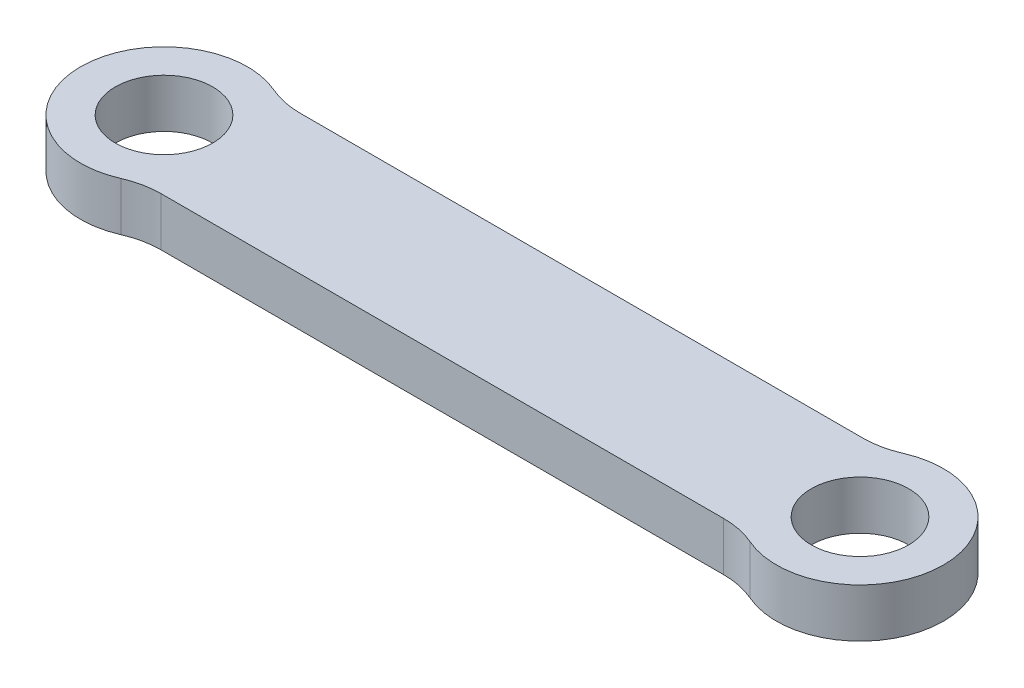
ISO-10303-21;
HEADER;
FILE_DESCRIPTION(('STEP AP214'),'2;1');
FILE_NAME('part.step','',(''),(''),'','','');
FILE_SCHEMA(('AUTOMOTIVE_DESIGN { 1 0 10303 214 1 1 1 1 }'));
ENDSEC;
DATA;
#1=APPLICATION_CONTEXT('core data for automotive mechanical design processes');
#2=APPLICATION_PROTOCOL_DEFINITION('international standard','automotive_design',2000,#1);
#3=PRODUCT_CONTEXT('',#1,'mechanical');
#4=PRODUCT('Part','Part','',(#3));
#5=PRODUCT_RELATED_PRODUCT_CATEGORY('part','',(#4));
#6=PRODUCT_DEFINITION_FORMATION('','',#4);
#7=PRODUCT_DEFINITION_CONTEXT('part definition',#1,'design');
#8=PRODUCT_DEFINITION('design','',#6,#7);
#9=PRODUCT_DEFINITION_SHAPE('','',#8);
#10=(LENGTH_UNIT() NAMED_UNIT(*) SI_UNIT(.MILLI.,.METRE.));
#11=(NAMED_UNIT(*) PLANE_ANGLE_UNIT() SI_UNIT($,.RADIAN.));
#12=(NAMED_UNIT(*) SI_UNIT($,.STERADIAN.) SOLID_ANGLE_UNIT());
#13=UNCERTAINTY_MEASURE_WITH_UNIT(LENGTH_MEASURE(1.E-05),#10,'distance_accuracy_value','');
#14=(GEOMETRIC_REPRESENTATION_CONTEXT(3) GLOBAL_UNCERTAINTY_ASSIGNED_CONTEXT((#13)) GLOBAL_UNIT_ASSIGNED_CONTEXT((#10,
#11,#12)) REPRESENTATION_CONTEXT('',''));
#15=CARTESIAN_POINT('',(0.,0.,0.));
#16=DIRECTION('',(0.,0.,1.));
#17=DIRECTION('',(1.,0.,0.));
#18=AXIS2_PLACEMENT_3D('',#15,#16,#17);
#19=CARTESIAN_POINT('',(25.,1.75,0.));
#20=DIRECTION('',(0.,-1.,0.));
#21=DIRECTION('',(0.,0.,-1.));
#22=AXIS2_PLACEMENT_3D('',#19,#20,#21);
#23=CYLINDRICAL_SURFACE('',#22,3.);
#24=CARTESIAN_POINT('',(25.,1.75,0.));
#25=DIRECTION('',(0.,1.,0.));
#26=DIRECTION('',(0.,0.,1.));
#27=AXIS2_PLACEMENT_3D('',#24,#25,#26);
#28=CIRCLE('',#27,3.);
#29=CARTESIAN_POINT('',(23.8010421191718,1.75,2.75));
#30=VERTEX_POINT('',#29);
#31=CARTESIAN_POINT('',(23.8010421191718,1.75,-2.75));
#32=VERTEX_POINT('',#31);
#33=EDGE_CURVE('E143',#30,#32,#28,.T.);
#34=ORIENTED_EDGE('',*,*,#33,.F.);
#35=DIRECTION('',(0.,-1.,0.));
#36=VECTOR('',#35,1.);
#37=CARTESIAN_POINT('',(23.8010421191718,1.75,2.75));
#38=LINE('',#37,#36);
#39=CARTESIAN_POINT('',(23.8010421191718,0.,2.75));
#40=VERTEX_POINT('',#39);
#41=EDGE_CURVE('E151',#30,#40,#38,.T.);
#42=ORIENTED_EDGE('',*,*,#41,.T.);
#43=CARTESIAN_POINT('',(25.,0.,0.));
#44=DIRECTION('',(0.,1.,0.));
#45=DIRECTION('',(0.,0.,1.));
#46=AXIS2_PLACEMENT_3D('',#43,#44,#45);
#47=CIRCLE('',#46,3.);
#48=CARTESIAN_POINT('',(23.8010421191718,0.,-2.75));
#49=VERTEX_POINT('',#48);
#50=EDGE_CURVE('E168',#40,#49,#47,.T.);
#51=ORIENTED_EDGE('',*,*,#50,.T.);
#52=DIRECTION('',(0.,-1.,0.));
#53=VECTOR('',#52,1.);
#54=CARTESIAN_POINT('',(23.8010421191718,1.75,-2.75));
#55=LINE('',#54,#53);
#56=EDGE_CURVE('E149',#49,#32,#55,.F.);
#57=ORIENTED_EDGE('',*,*,#56,.T.);
#58=EDGE_LOOP('',(#34,#42,#51,#57));
#59=FACE_BOUND('',#58,.T.);
#60=ADVANCED_FACE('F37',(#59),#23,.T.);
#61=CARTESIAN_POINT('',(0.,1.75,-2.5));
#62=DIRECTION('',(0.,0.,-1.));
#63=DIRECTION('',(-1.,0.,0.));
#64=AXIS2_PLACEMENT_3D('',#61,#62,#63);
#65=PLANE('',#64);
#66=DIRECTION('',(1.,0.,0.));
#67=VECTOR('',#66,1.);
#68=CARTESIAN_POINT('',(0.,1.75,-2.5));
#69=LINE('',#68,#67);
#70=CARTESIAN_POINT('',(2.39791576165636,1.75,-2.5));
#71=VERTEX_POINT('',#70);
#72=CARTESIAN_POINT('',(22.6020842383436,1.75,-2.5));
#73=VERTEX_POINT('',#72);
#74=EDGE_CURVE('E175',#71,#73,#69,.T.);
#75=ORIENTED_EDGE('',*,*,#74,.T.);
#76=DIRECTION('',(0.,-1.,0.));
#77=VECTOR('',#76,1.);
#78=CARTESIAN_POINT('',(22.6020842383436,1.75,-2.5));
#79=LINE('',#78,#77);
#80=CARTESIAN_POINT('',(22.6020842383436,0.,-2.5));
#81=VERTEX_POINT('',#80);
#82=EDGE_CURVE('E114',#73,#81,#79,.T.);
#83=ORIENTED_EDGE('',*,*,#82,.T.);
#84=DIRECTION('',(1.,0.,0.));
#85=VECTOR('',#84,1.);
#86=CARTESIAN_POINT('',(0.,0.,-2.5));
#87=LINE('',#86,#85);
#88=CARTESIAN_POINT('',(2.39791576165636,0.,-2.5));
#89=VERTEX_POINT('',#88);
#90=EDGE_CURVE('E137',#89,#81,#87,.T.);
#91=ORIENTED_EDGE('',*,*,#90,.F.);
#92=DIRECTION('',(0.,-1.,0.));
#93=VECTOR('',#92,1.);
#94=CARTESIAN_POINT('',(2.39791576165636,1.75,-2.5));
#95=LINE('',#94,#93);
#96=EDGE_CURVE('E59',#89,#71,#95,.F.);
#97=ORIENTED_EDGE('',*,*,#96,.T.);
#98=EDGE_LOOP('',(#75,#83,#91,#97));
#99=FACE_BOUND('',#98,.T.);
#100=ADVANCED_FACE('F166',(#99),#65,.T.);
#101=CARTESIAN_POINT('',(0.,1.75,0.));
#102=DIRECTION('',(0.,-1.,0.));
#103=DIRECTION('',(0.,0.,-1.));
#104=AXIS2_PLACEMENT_3D('',#101,#102,#103);
#105=CYLINDRICAL_SURFACE('',#104,3.);
#106=CARTESIAN_POINT('',(0.,0.,0.));
#107=DIRECTION('',(0.,1.,0.));
#108=DIRECTION('',(0.,0.,1.));
#109=AXIS2_PLACEMENT_3D('',#106,#107,#108);
#110=CIRCLE('',#109,3.);
#111=CARTESIAN_POINT('',(1.19895788082818,0.,-2.75));
#112=VERTEX_POINT('',#111);
#113=CARTESIAN_POINT('',(1.19895788082818,0.,2.75));
#114=VERTEX_POINT('',#113);
#115=EDGE_CURVE('E132',#112,#114,#110,.T.);
#116=ORIENTED_EDGE('',*,*,#115,.T.);
#117=DIRECTION('',(0.,-1.,0.));
#118=VECTOR('',#117,1.);
#119=CARTESIAN_POINT('',(1.19895788082818,1.75,2.75));
#120=LINE('',#119,#118);
#121=CARTESIAN_POINT('',(1.19895788082818,1.75,2.75));
#122=VERTEX_POINT('',#121);
#123=EDGE_CURVE('E108',#114,#122,#120,.F.);
#124=ORIENTED_EDGE('',*,*,#123,.T.);
#125=CARTESIAN_POINT('',(0.,1.75,0.));
#126=DIRECTION('',(0.,1.,0.));
#127=DIRECTION('',(0.,0.,1.));
#128=AXIS2_PLACEMENT_3D('',#125,#126,#127);
#129=CIRCLE('',#128,3.);
#130=CARTESIAN_POINT('',(1.19895788082818,1.75,-2.75));
#131=VERTEX_POINT('',#130);
#132=EDGE_CURVE('E174',#131,#122,#129,.T.);
#133=ORIENTED_EDGE('',*,*,#132,.F.);
#134=DIRECTION('',(0.,-1.,0.));
#135=VECTOR('',#134,1.);
#136=CARTESIAN_POINT('',(1.19895788082818,1.75,-2.75));
#137=LINE('',#136,#135);
#138=EDGE_CURVE('E124',#131,#112,#137,.T.);
#139=ORIENTED_EDGE('',*,*,#138,.T.);
#140=EDGE_LOOP('',(#116,#124,#133,#139));
#141=FACE_BOUND('',#140,.T.);
#142=ADVANCED_FACE('F177',(#141),#105,.T.);
#143=CARTESIAN_POINT('',(0.,1.75,0.));
#144=DIRECTION('',(0.,-1.,0.));
#145=DIRECTION('',(0.,0.,-1.));
#146=AXIS2_PLACEMENT_3D('',#143,#144,#145);
#147=CYLINDRICAL_SURFACE('',#146,1.75);
#148=CARTESIAN_POINT('',(0.,1.75,0.));
#149=DIRECTION('',(0.,1.,0.));
#150=DIRECTION('',(0.,0.,1.));
#151=AXIS2_PLACEMENT_3D('',#148,#149,#150);
#152=CIRCLE('',#151,1.75);
#153=CARTESIAN_POINT('',(0.,1.75,1.75));
#154=VERTEX_POINT('',#153);
#155=EDGE_CURVE('E179',#154,#154,#152,.T.);
#156=ORIENTED_EDGE('',*,*,#155,.T.);
#157=EDGE_LOOP('',(#156));
#158=FACE_BOUND('',#157,.T.);
#159=CARTESIAN_POINT('',(0.,0.,0.));
#160=DIRECTION('',(0.,1.,0.));
#161=DIRECTION('',(0.,0.,1.));
#162=AXIS2_PLACEMENT_3D('',#159,#160,#161);
#163=CIRCLE('',#162,1.75);
#164=CARTESIAN_POINT('',(0.,0.,1.75));
#165=VERTEX_POINT('',#164);
#166=EDGE_CURVE('E131',#165,#165,#163,.T.);
#167=ORIENTED_EDGE('',*,*,#166,.F.);
#168=EDGE_LOOP('',(#167));
#169=FACE_BOUND('',#168,.T.);
#170=ADVANCED_FACE('F225',(#158,#169),#147,.F.);
#171=CARTESIAN_POINT('',(0.,1.75,2.5));
#172=DIRECTION('',(0.,0.,-1.));
#173=DIRECTION('',(-1.,0.,0.));
#174=AXIS2_PLACEMENT_3D('',#171,#172,#173);
#175=PLANE('',#174);
#176=DIRECTION('',(1.,0.,0.));
#177=VECTOR('',#176,1.);
#178=CARTESIAN_POINT('',(0.,1.75,2.5));
#179=LINE('',#178,#177);
#180=CARTESIAN_POINT('',(2.39791576165636,1.75,2.5));
#181=VERTEX_POINT('',#180);
#182=CARTESIAN_POINT('',(22.6020842383436,1.75,2.5));
#183=VERTEX_POINT('',#182);
#184=EDGE_CURVE('E123',#181,#183,#179,.T.);
#185=ORIENTED_EDGE('',*,*,#184,.F.);
#186=DIRECTION('',(0.,1.,0.));
#187=VECTOR('',#186,1.);
#188=CARTESIAN_POINT('',(2.39791576165636,0.,2.5));
#189=LINE('',#188,#187);
#190=CARTESIAN_POINT('',(2.39791576165636,0.,2.5));
#191=VERTEX_POINT('',#190);
#192=EDGE_CURVE('E107',#181,#191,#189,.F.);
#193=ORIENTED_EDGE('',*,*,#192,.T.);
#194=DIRECTION('',(1.,0.,0.));
#195=VECTOR('',#194,1.);
#196=CARTESIAN_POINT('',(0.,0.,2.5));
#197=LINE('',#196,#195);
#198=CARTESIAN_POINT('',(22.6020842383436,0.,2.5));
#199=VERTEX_POINT('',#198);
#200=EDGE_CURVE('E120',#191,#199,#197,.T.);
#201=ORIENTED_EDGE('',*,*,#200,.T.);
#202=DIRECTION('',(0.,1.,0.));
#203=VECTOR('',#202,1.);
#204=CARTESIAN_POINT('',(22.6020842383436,1.75,2.5));
#205=LINE('',#204,#203);
#206=EDGE_CURVE('E125',#199,#183,#205,.T.);
#207=ORIENTED_EDGE('',*,*,#206,.T.);
#208=EDGE_LOOP('',(#185,#193,#201,#207));
#209=FACE_BOUND('',#208,.T.);
#210=ADVANCED_FACE('F119',(#209),#175,.F.);
#211=CARTESIAN_POINT('',(25.,1.75,0.));
#212=DIRECTION('',(0.,-1.,0.));
#213=DIRECTION('',(0.,0.,-1.));
#214=AXIS2_PLACEMENT_3D('',#211,#212,#213);
#215=CYLINDRICAL_SURFACE('',#214,1.75);
#216=CARTESIAN_POINT('',(25.,1.75,0.));
#217=DIRECTION('',(0.,1.,0.));
#218=DIRECTION('',(0.,0.,1.));
#219=AXIS2_PLACEMENT_3D('',#216,#217,#218);
#220=CIRCLE('',#219,1.75);
#221=CARTESIAN_POINT('',(25.,1.75,1.75));
#222=VERTEX_POINT('',#221);
#223=EDGE_CURVE('E144',#222,#222,#220,.T.);
#224=ORIENTED_EDGE('',*,*,#223,.T.);
#225=EDGE_LOOP('',(#224));
#226=FACE_BOUND('',#225,.T.);
#227=CARTESIAN_POINT('',(25.,0.,0.));
#228=DIRECTION('',(0.,1.,0.));
#229=DIRECTION('',(0.,0.,1.));
#230=AXIS2_PLACEMENT_3D('',#227,#228,#229);
#231=CIRCLE('',#230,1.75);
#232=CARTESIAN_POINT('',(25.,0.,1.75));
#233=VERTEX_POINT('',#232);
#234=EDGE_CURVE('E135',#233,#233,#231,.T.);
#235=ORIENTED_EDGE('',*,*,#234,.F.);
#236=EDGE_LOOP('',(#235));
#237=FACE_BOUND('',#236,.T.);
#238=ADVANCED_FACE('F219',(#226,#237),#215,.F.);
#239=CARTESIAN_POINT('',(0.,1.75,0.));
#240=DIRECTION('',(0.,1.,0.));
#241=DIRECTION('',(0.,0.,1.));
#242=AXIS2_PLACEMENT_3D('',#239,#240,#241);
#243=PLANE('',#242);
#244=ORIENTED_EDGE('',*,*,#184,.T.);
#245=CARTESIAN_POINT('',(22.6020842383436,1.75,5.5));
#246=DIRECTION('',(0.,1.,0.));
#247=DIRECTION('',(0.,0.,1.));
#248=AXIS2_PLACEMENT_3D('',#245,#246,#247);
#249=CIRCLE('',#248,3.);
#250=EDGE_CURVE('E159',#183,#30,#249,.F.);
#251=ORIENTED_EDGE('',*,*,#250,.T.);
#252=ORIENTED_EDGE('',*,*,#33,.T.);
#253=CARTESIAN_POINT('',(22.6020842383436,1.75,-5.5));
#254=DIRECTION('',(0.,1.,0.));
#255=DIRECTION('',(0.,0.,1.));
#256=AXIS2_PLACEMENT_3D('',#253,#254,#255);
#257=CIRCLE('',#256,3.);
#258=EDGE_CURVE('E52',#32,#73,#257,.F.);
#259=ORIENTED_EDGE('',*,*,#258,.T.);
#260=ORIENTED_EDGE('',*,*,#74,.F.);
#261=CARTESIAN_POINT('',(2.39791576165636,1.75,-5.5));
#262=DIRECTION('',(0.,1.,0.));
#263=DIRECTION('',(0.,0.,1.));
#264=AXIS2_PLACEMENT_3D('',#261,#262,#263);
#265=CIRCLE('',#264,3.);
#266=EDGE_CURVE('E11',#71,#131,#265,.F.);
#267=ORIENTED_EDGE('',*,*,#266,.T.);
#268=ORIENTED_EDGE('',*,*,#132,.T.);
#269=CARTESIAN_POINT('',(2.39791576165636,1.75,5.5));
#270=DIRECTION('',(0.,1.,0.));
#271=DIRECTION('',(0.,0.,1.));
#272=AXIS2_PLACEMENT_3D('',#269,#270,#271);
#273=CIRCLE('',#272,3.);
#274=EDGE_CURVE('E113',#122,#181,#273,.F.);
#275=ORIENTED_EDGE('',*,*,#274,.T.);
#276=EDGE_LOOP('',(#244,#251,#252,#259,#260,#267,#268,#275));
#277=FACE_BOUND('',#276,.T.);
#278=ORIENTED_EDGE('',*,*,#155,.F.);
#279=EDGE_LOOP('',(#278));
#280=FACE_BOUND('',#279,.T.);
#281=ORIENTED_EDGE('',*,*,#223,.F.);
#282=EDGE_LOOP('',(#281));
#283=FACE_BOUND('',#282,.T.);
#284=ADVANCED_FACE('F172',(#277,#280,#283),#243,.T.);
#285=CARTESIAN_POINT('',(0.,0.,0.));
#286=DIRECTION('',(0.,1.,0.));
#287=DIRECTION('',(0.,0.,1.));
#288=AXIS2_PLACEMENT_3D('',#285,#286,#287);
#289=PLANE('',#288);
#290=ORIENTED_EDGE('',*,*,#50,.F.);
#291=CARTESIAN_POINT('',(22.6020842383436,0.,5.5));
#292=DIRECTION('',(0.,1.,0.));
#293=DIRECTION('',(0.,0.,1.));
#294=AXIS2_PLACEMENT_3D('',#291,#292,#293);
#295=CIRCLE('',#294,3.);
#296=EDGE_CURVE('E130',#40,#199,#295,.T.);
#297=ORIENTED_EDGE('',*,*,#296,.T.);
#298=ORIENTED_EDGE('',*,*,#200,.F.);
#299=CARTESIAN_POINT('',(2.39791576165636,0.,5.5));
#300=DIRECTION('',(0.,1.,0.));
#301=DIRECTION('',(0.,0.,1.));
#302=AXIS2_PLACEMENT_3D('',#299,#300,#301);
#303=CIRCLE('',#302,3.);
#304=EDGE_CURVE('E103',#191,#114,#303,.T.);
#305=ORIENTED_EDGE('',*,*,#304,.T.);
#306=ORIENTED_EDGE('',*,*,#115,.F.);
#307=CARTESIAN_POINT('',(2.39791576165636,0.,-5.5));
#308=DIRECTION('',(0.,1.,0.));
#309=DIRECTION('',(0.,0.,1.));
#310=AXIS2_PLACEMENT_3D('',#307,#308,#309);
#311=CIRCLE('',#310,3.);
#312=EDGE_CURVE('E45',#112,#89,#311,.T.);
#313=ORIENTED_EDGE('',*,*,#312,.T.);
#314=ORIENTED_EDGE('',*,*,#90,.T.);
#315=CARTESIAN_POINT('',(22.6020842383436,0.,-5.5));
#316=DIRECTION('',(0.,1.,0.));
#317=DIRECTION('',(0.,0.,1.));
#318=AXIS2_PLACEMENT_3D('',#315,#316,#317);
#319=CIRCLE('',#318,3.);
#320=EDGE_CURVE('E161',#81,#49,#319,.T.);
#321=ORIENTED_EDGE('',*,*,#320,.T.);
#322=EDGE_LOOP('',(#290,#297,#298,#305,#306,#313,#314,#321));
#323=FACE_BOUND('',#322,.T.);
#324=ORIENTED_EDGE('',*,*,#166,.T.);
#325=EDGE_LOOP('',(#324));
#326=FACE_BOUND('',#325,.T.);
#327=ORIENTED_EDGE('',*,*,#234,.T.);
#328=EDGE_LOOP('',(#327));
#329=FACE_BOUND('',#328,.T.);
#330=ADVANCED_FACE('F128',(#323,#326,#329),#289,.F.);
#331=CARTESIAN_POINT('',(2.39791576165636,1.75,5.5));
#332=DIRECTION('',(0.,-1.,0.));
#333=DIRECTION('',(0.,0.,-1.));
#334=AXIS2_PLACEMENT_3D('',#331,#332,#333);
#335=CYLINDRICAL_SURFACE('',#334,3.);
#336=ORIENTED_EDGE('',*,*,#274,.F.);
#337=ORIENTED_EDGE('',*,*,#123,.F.);
#338=ORIENTED_EDGE('',*,*,#304,.F.);
#339=ORIENTED_EDGE('',*,*,#192,.F.);
#340=EDGE_LOOP('',(#336,#337,#338,#339));
#341=FACE_BOUND('',#340,.T.);
#342=ADVANCED_FACE('F106',(#341),#335,.F.);
#343=CARTESIAN_POINT('',(22.6020842383436,1.75,5.5));
#344=DIRECTION('',(0.,-1.,0.));
#345=DIRECTION('',(0.,0.,-1.));
#346=AXIS2_PLACEMENT_3D('',#343,#344,#345);
#347=CYLINDRICAL_SURFACE('',#346,3.);
#348=ORIENTED_EDGE('',*,*,#250,.F.);
#349=ORIENTED_EDGE('',*,*,#206,.F.);
#350=ORIENTED_EDGE('',*,*,#296,.F.);
#351=ORIENTED_EDGE('',*,*,#41,.F.);
#352=EDGE_LOOP('',(#348,#349,#350,#351));
#353=FACE_BOUND('',#352,.T.);
#354=ADVANCED_FACE('F196',(#353),#347,.F.);
#355=CARTESIAN_POINT('',(22.6020842383436,1.75,-5.5));
#356=DIRECTION('',(0.,-1.,0.));
#357=DIRECTION('',(0.,0.,-1.));
#358=AXIS2_PLACEMENT_3D('',#355,#356,#357);
#359=CYLINDRICAL_SURFACE('',#358,3.);
#360=ORIENTED_EDGE('',*,*,#258,.F.);
#361=ORIENTED_EDGE('',*,*,#56,.F.);
#362=ORIENTED_EDGE('',*,*,#320,.F.);
#363=ORIENTED_EDGE('',*,*,#82,.F.);
#364=EDGE_LOOP('',(#360,#361,#362,#363));
#365=FACE_BOUND('',#364,.T.);
#366=ADVANCED_FACE('F194',(#365),#359,.F.);
#367=CARTESIAN_POINT('',(2.39791576165636,1.75,-5.5));
#368=DIRECTION('',(0.,-1.,0.));
#369=DIRECTION('',(0.,0.,-1.));
#370=AXIS2_PLACEMENT_3D('',#367,#368,#369);
#371=CYLINDRICAL_SURFACE('',#370,3.);
#372=ORIENTED_EDGE('',*,*,#266,.F.);
#373=ORIENTED_EDGE('',*,*,#96,.F.);
#374=ORIENTED_EDGE('',*,*,#312,.F.);
#375=ORIENTED_EDGE('',*,*,#138,.F.);
#376=EDGE_LOOP('',(#372,#373,#374,#375));
#377=FACE_BOUND('',#376,.T.);
#378=ADVANCED_FACE('F39',(#377),#371,.F.);
#379=CLOSED_SHELL('',(#60,#100,#142,#170,#210,#238,#284,#330,#342,#354,#366,#378));
#380=MANIFOLD_SOLID_BREP('B2',#379);
#381=ADVANCED_BREP_SHAPE_REPRESENTATION('',(#18,#380),#14);
#382=SHAPE_DEFINITION_REPRESENTATION(#9,#381);
ENDSEC;
END-ISO-10303-21;
